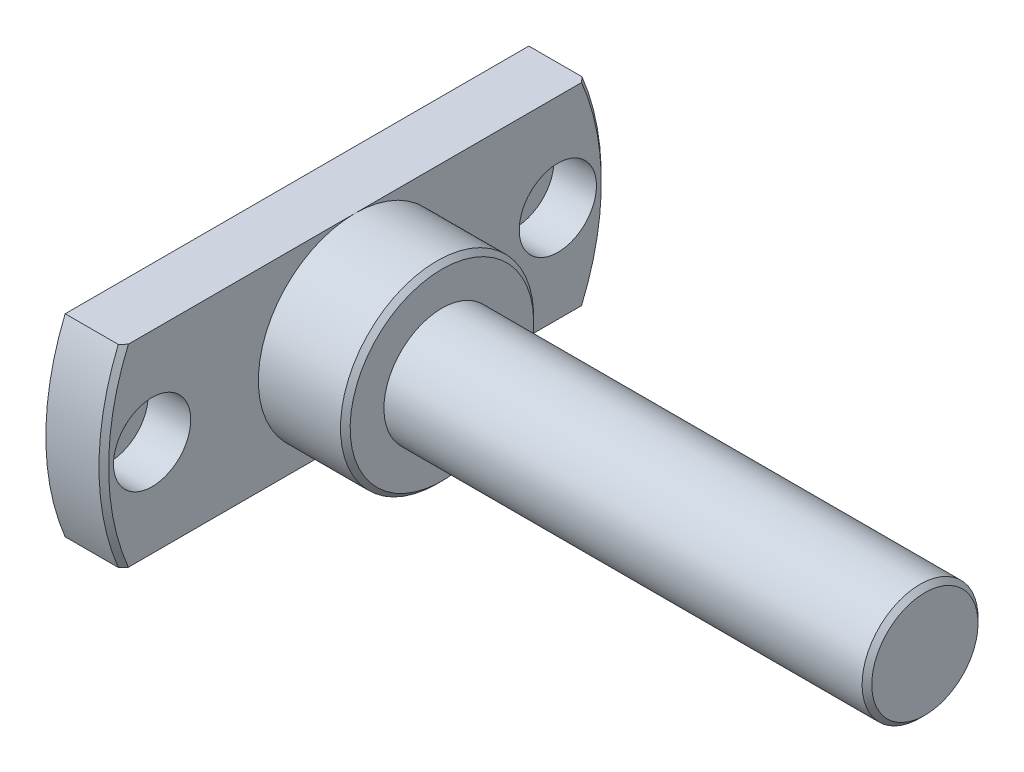
ISO-10303-21;
HEADER;
FILE_DESCRIPTION(('STEP AP214'),'2;1');
FILE_NAME('part.step','',(''),(''),'','','');
FILE_SCHEMA(('AUTOMOTIVE_DESIGN { 1 0 10303 214 1 1 1 1 }'));
ENDSEC;
DATA;
#1=APPLICATION_CONTEXT('core data for automotive mechanical design processes');
#2=APPLICATION_PROTOCOL_DEFINITION('international standard','automotive_design',2000,#1);
#3=PRODUCT_CONTEXT('',#1,'mechanical');
#4=PRODUCT('Part','Part','',(#3));
#5=PRODUCT_RELATED_PRODUCT_CATEGORY('part','',(#4));
#6=PRODUCT_DEFINITION_FORMATION('','',#4);
#7=PRODUCT_DEFINITION_CONTEXT('part definition',#1,'design');
#8=PRODUCT_DEFINITION('design','',#6,#7);
#9=PRODUCT_DEFINITION_SHAPE('','',#8);
#10=(LENGTH_UNIT() NAMED_UNIT(*) SI_UNIT(.MILLI.,.METRE.));
#11=(NAMED_UNIT(*) PLANE_ANGLE_UNIT() SI_UNIT($,.RADIAN.));
#12=(NAMED_UNIT(*) SI_UNIT($,.STERADIAN.) SOLID_ANGLE_UNIT());
#13=UNCERTAINTY_MEASURE_WITH_UNIT(LENGTH_MEASURE(1.E-05),#10,'distance_accuracy_value','');
#14=(GEOMETRIC_REPRESENTATION_CONTEXT(3) GLOBAL_UNCERTAINTY_ASSIGNED_CONTEXT((#13)) GLOBAL_UNIT_ASSIGNED_CONTEXT((#10,
#11,#12)) REPRESENTATION_CONTEXT('',''));
#15=CARTESIAN_POINT('',(0.,0.,0.));
#16=DIRECTION('',(0.,0.,1.));
#17=DIRECTION('',(1.,0.,0.));
#18=AXIS2_PLACEMENT_3D('',#15,#16,#17);
#19=CARTESIAN_POINT('',(6.,26.,0.));
#20=DIRECTION('',(1.,0.,0.));
#21=DIRECTION('',(0.,1.,0.));
#22=AXIS2_PLACEMENT_3D('',#19,#20,#21);
#23=PLANE('',#22);
#24=DIRECTION('',(0.,0.,-1.));
#25=VECTOR('',#24,1.);
#26=CARTESIAN_POINT('',(6.,10.,0.));
#27=LINE('',#26,#25);
#28=CARTESIAN_POINT('',(6.,10.,23.4574082114798));
#29=VERTEX_POINT('',#28);
#30=CARTESIAN_POINT('',(6.,10.,0.));
#31=VERTEX_POINT('',#30);
#32=EDGE_CURVE('E419',#29,#31,#27,.T.);
#33=ORIENTED_EDGE('',*,*,#32,.F.);
#34=CARTESIAN_POINT('',(6.,0.,0.));
#35=DIRECTION('',(1.,0.,0.));
#36=DIRECTION('',(0.,1.,0.));
#37=AXIS2_PLACEMENT_3D('',#34,#35,#36);
#38=CIRCLE('',#37,25.5);
#39=CARTESIAN_POINT('',(6.,-10.,23.4574082114798));
#40=VERTEX_POINT('',#39);
#41=EDGE_CURVE('E58',#29,#40,#38,.T.);
#42=ORIENTED_EDGE('',*,*,#41,.T.);
#43=DIRECTION('',(0.,0.,1.));
#44=VECTOR('',#43,1.);
#45=CARTESIAN_POINT('',(6.,-10.,0.));
#46=LINE('',#45,#44);
#47=CARTESIAN_POINT('',(6.00000000000001,-10.,0.));
#48=VERTEX_POINT('',#47);
#49=EDGE_CURVE('E408',#48,#40,#46,.T.);
#50=ORIENTED_EDGE('',*,*,#49,.F.);
#51=CARTESIAN_POINT('',(6.00000000000001,0.,0.));
#52=DIRECTION('',(1.,0.,0.));
#53=DIRECTION('',(0.,1.,0.));
#54=AXIS2_PLACEMENT_3D('',#51,#52,#53);
#55=CIRCLE('',#54,9.99999999999999);
#56=EDGE_CURVE('E118',#31,#48,#55,.T.);
#57=ORIENTED_EDGE('',*,*,#56,.F.);
#58=EDGE_LOOP('',(#33,#42,#50,#57));
#59=FACE_BOUND('',#58,.T.);
#60=CARTESIAN_POINT('',(6.,0.,21.));
#61=DIRECTION('',(1.,0.,0.));
#62=DIRECTION('',(0.,0.,-1.));
#63=AXIS2_PLACEMENT_3D('',#60,#61,#62);
#64=CIRCLE('',#63,4.);
#65=CARTESIAN_POINT('',(6.,0.,17.));
#66=VERTEX_POINT('',#65);
#67=EDGE_CURVE('E403',#66,#66,#64,.T.);
#68=ORIENTED_EDGE('',*,*,#67,.F.);
#69=EDGE_LOOP('',(#68));
#70=FACE_BOUND('',#69,.T.);
#71=ADVANCED_FACE('F35',(#59,#70),#23,.T.);
#72=CARTESIAN_POINT('',(65.,0.,0.));
#73=DIRECTION('',(1.,0.,0.));
#74=DIRECTION('',(0.,1.,0.));
#75=AXIS2_PLACEMENT_3D('',#72,#73,#74);
#76=CYLINDRICAL_SURFACE('',#75,26.);
#77=DIRECTION('',(-1.,0.,0.));
#78=VECTOR('',#77,1.);
#79=CARTESIAN_POINT('',(65.,10.,-24.));
#80=LINE('',#79,#78);
#81=CARTESIAN_POINT('',(5.50000000000001,10.,-24.));
#82=VERTEX_POINT('',#81);
#83=CARTESIAN_POINT('',(0.,10.,-24.));
#84=VERTEX_POINT('',#83);
#85=EDGE_CURVE('E94',#82,#84,#80,.T.);
#86=ORIENTED_EDGE('',*,*,#85,.F.);
#87=CARTESIAN_POINT('',(5.50000000000002,0.,0.));
#88=DIRECTION('',(1.,0.,0.));
#89=DIRECTION('',(0.,1.,0.));
#90=AXIS2_PLACEMENT_3D('',#87,#88,#89);
#91=CIRCLE('',#90,26.);
#92=CARTESIAN_POINT('',(5.50000000000001,-10.,-24.));
#93=VERTEX_POINT('',#92);
#94=EDGE_CURVE('E130',#82,#93,#91,.F.);
#95=ORIENTED_EDGE('',*,*,#94,.T.);
#96=DIRECTION('',(-1.,0.,0.));
#97=VECTOR('',#96,1.);
#98=CARTESIAN_POINT('',(65.,-10.,-24.));
#99=LINE('',#98,#97);
#100=CARTESIAN_POINT('',(0.,-10.,-24.));
#101=VERTEX_POINT('',#100);
#102=EDGE_CURVE('E117',#93,#101,#99,.T.);
#103=ORIENTED_EDGE('',*,*,#102,.T.);
#104=CARTESIAN_POINT('',(0.,0.,0.));
#105=DIRECTION('',(1.,0.,0.));
#106=DIRECTION('',(0.,1.,0.));
#107=AXIS2_PLACEMENT_3D('',#104,#105,#106);
#108=CIRCLE('',#107,26.);
#109=EDGE_CURVE('E111',#101,#84,#108,.T.);
#110=ORIENTED_EDGE('',*,*,#109,.T.);
#111=EDGE_LOOP('',(#86,#95,#103,#110));
#112=FACE_BOUND('',#111,.T.);
#113=ADVANCED_FACE('F115',(#112),#76,.T.);
#114=CARTESIAN_POINT('',(6.,0.,0.));
#115=DIRECTION('',(-1.,0.,0.));
#116=DIRECTION('',(0.,-1.,0.));
#117=AXIS2_PLACEMENT_3D('',#114,#115,#116);
#118=CONICAL_SURFACE('',#117,25.5,0.785398163397462);
#119=CARTESIAN_POINT('',(-22.2403583783222,10.,52.8017624576168));
#120=CARTESIAN_POINT('',(-21.5612747358873,10.,52.1106050160797));
#121=CARTESIAN_POINT('',(-20.8824233158428,10.,51.4192193838014));
#122=CARTESIAN_POINT('',(-19.525248352431,10.,50.0359261725188));
#123=CARTESIAN_POINT('',(-18.846924810646,10.,49.3440185919621));
#124=CARTESIAN_POINT('',(-16.8111346974459,10.,47.2656724387419));
#125=CARTESIAN_POINT('',(-15.4545641827864,10.,45.8783558396122));
#126=CARTESIAN_POINT('',(-12.7146414691651,10.,43.0700793252078));
#127=CARTESIAN_POINT('',(-11.3313582605314,10.,41.6490520570187));
#128=CARTESIAN_POINT('',(-9.26056882032157,10.,39.5152271167261));
#129=CARTESIAN_POINT('',(-8.57142564600669,10.,38.8040180479717));
#130=CARTESIAN_POINT('',(-7.1944446370752,10.,37.3803787892495));
#131=CARTESIAN_POINT('',(-6.50660676371825,10.,36.6679486367558));
#132=CARTESIAN_POINT('',(-4.66442319301412,10.,34.7558493459511));
#133=CARTESIAN_POINT('',(-3.51145767762059,10.,33.5548495694882));
#134=CARTESIAN_POINT('',(-1.21113151758138,10.,31.1471526212081));
#135=CARTESIAN_POINT('',(-0.0637717101532882,10.,29.9404546482762));
#136=CARTESIAN_POINT('',(1.65391399916357,10.,28.1216723075976));
#137=CARTESIAN_POINT('',(2.22729650078359,10.,27.5124748735986));
#138=CARTESIAN_POINT('',(3.37155146238387,10.,26.2917280770571));
#139=CARTESIAN_POINT('',(3.94242392727216,10.,25.6801787191179));
#140=CARTESIAN_POINT('',(5.0807938221149,10.,24.4545699302876));
#141=CARTESIAN_POINT('',(5.64829293235741,10.,23.8405120611177));
#142=CARTESIAN_POINT('',(6.77949024144209,10.,22.6089132821059));
#143=CARTESIAN_POINT('',(7.34318847721862,10.,21.9913724062168));
#144=CARTESIAN_POINT('',(8.45482303067721,10.,20.7640686698923));
#145=CARTESIAN_POINT('',(9.00285201713899,10.,20.1543898527024));
#146=CARTESIAN_POINT('',(10.093041084654,10.,18.9297578613442));
#147=CARTESIAN_POINT('',(10.6352009308297,10.,18.3148044778448));
#148=CARTESIAN_POINT('',(11.7130178617387,10.,17.0768233048052));
#149=CARTESIAN_POINT('',(12.2486580335642,10.,16.4537807383512));
#150=CARTESIAN_POINT('',(13.0442661083262,10.,15.5126399503163));
#151=CARTESIAN_POINT('',(13.3081457132626,10.,15.1978478048739));
#152=CARTESIAN_POINT('',(13.8328305138945,10.,14.565713573772));
#153=CARTESIAN_POINT('',(14.0936357394756,10.,14.2483715129503));
#154=CARTESIAN_POINT('',(14.6091690836004,10.,13.6137461412684));
#155=CARTESIAN_POINT('',(14.8639313355643,10.,13.2964905904598));
#156=CARTESIAN_POINT('',(15.3692096484206,10.,12.6586062072016));
#157=CARTESIAN_POINT('',(15.6197256724818,10.,12.3379773455315));
#158=CARTESIAN_POINT('',(16.1157896699968,10.,11.6925865464576));
#159=CARTESIAN_POINT('',(16.3613345827448,10.,11.3678222519717));
#160=CARTESIAN_POINT('',(16.8461812999863,10.,10.7136656933156));
#161=CARTESIAN_POINT('',(17.085483242339,10.,10.384273531587));
#162=CARTESIAN_POINT('',(17.5555071445035,10.,9.72128358219486));
#163=CARTESIAN_POINT('',(17.7862582138339,10.,9.38770649375731));
#164=CARTESIAN_POINT('',(18.238278605045,10.,8.71410595268329));
#165=CARTESIAN_POINT('',(18.459546895644,10.,8.37408180467986));
#166=CARTESIAN_POINT('',(18.8898308219094,10.,7.68687780250099));
#167=CARTESIAN_POINT('',(19.0988601157554,10.,7.33970653268233));
#168=CARTESIAN_POINT('',(19.5015934388649,10.,6.63662584521409));
#169=CARTESIAN_POINT('',(19.6953025283389,10.,6.28071936409857));
#170=CARTESIAN_POINT('',(19.9188660000856,10.,5.84184430737448));
#171=CARTESIAN_POINT('',(19.9581278701709,10.,5.76363238720583));
#172=CARTESIAN_POINT('',(20.0356807050489,10.,5.60671694250312));
#173=CARTESIAN_POINT('',(20.0739715573071,10.,5.52801336229436));
#174=CARTESIAN_POINT('',(20.1873178943465,10.,5.29112563682431));
#175=CARTESIAN_POINT('',(20.2608298221693,10.,5.13219843837458));
#176=CARTESIAN_POINT('',(20.4032579349509,10.,4.81229630603637));
#177=CARTESIAN_POINT('',(20.472174160992,10.,4.6513213904683));
#178=CARTESIAN_POINT('',(20.6048874366695,10.,4.32727695302568));
#179=CARTESIAN_POINT('',(20.6686846815542,10.,4.16420751131604));
#180=CARTESIAN_POINT('',(20.789876832807,10.,3.83789068332271));
#181=CARTESIAN_POINT('',(20.8473385841185,10.,3.67466825126644));
#182=CARTESIAN_POINT('',(20.9561368395426,10.,3.34620449479463));
#183=CARTESIAN_POINT('',(21.0074733289336,10.,3.18096316552785));
#184=CARTESIAN_POINT('',(21.1514076099207,10.,2.68226268311777));
#185=CARTESIAN_POINT('',(21.2339441194051,10.,2.3457902962389));
#186=CARTESIAN_POINT('',(21.357438212461,10.,1.71797671550052));
#187=CARTESIAN_POINT('',(21.4027945177991,10.,1.42750015545532));
#188=CARTESIAN_POINT('',(21.4686504516251,10.,0.843783113145917));
#189=CARTESIAN_POINT('',(21.489158356838,10.,0.550543584012278));
#190=CARTESIAN_POINT('',(21.5042295005792,10.,-0.0362191506601161));
#191=CARTESIAN_POINT('',(21.4988273529531,10.,-0.329741454284256));
#192=CARTESIAN_POINT('',(21.4624615172561,10.,-0.915225927086295));
#193=CARTESIAN_POINT('',(21.4314920930071,10.,-1.20718773136044));
#194=CARTESIAN_POINT('',(21.3341406265866,10.,-1.86451602224747));
#195=CARTESIAN_POINT('',(21.2605454204209,10.,-2.22881609874173));
#196=CARTESIAN_POINT('',(21.0800736488043,10.,-2.94902328659909));
#197=CARTESIAN_POINT('',(20.9731835551769,10.,-3.30492692302535));
#198=CARTESIAN_POINT('',(20.7312362984397,10.,-4.00956142465338));
#199=CARTESIAN_POINT('',(20.5959966208767,10.,-4.35822888296434));
#200=CARTESIAN_POINT('',(20.3765301149904,10.,-4.87398827446875));
#201=CARTESIAN_POINT('',(20.3006095089702,10.,-5.04469569459139));
#202=CARTESIAN_POINT('',(20.143814556541,10.,-5.38382317138972));
#203=CARTESIAN_POINT('',(20.0629402447436,10.,-5.55224324403713));
#204=CARTESIAN_POINT('',(19.8445029928583,10.,-5.99221737716304));
#205=CARTESIAN_POINT('',(19.7032986142867,10.,-6.26196414532372));
#206=CARTESIAN_POINT('',(19.4112317353663,10.,-6.79620036644));
#207=CARTESIAN_POINT('',(19.2603676084421,10.,-7.06068892410351));
#208=CARTESIAN_POINT('',(18.9505398110338,10.,-7.58509924112959));
#209=CARTESIAN_POINT('',(18.7915708486963,10.,-7.84501786380673));
#210=CARTESIAN_POINT('',(18.4669668206995,10.,-8.36062568773649));
#211=CARTESIAN_POINT('',(18.301332102517,10.,-8.61631510847383));
#212=CARTESIAN_POINT('',(17.964033962277,10.,-9.12461643177559));
#213=CARTESIAN_POINT('',(17.7923562539125,10.,-9.37721883237055));
#214=CARTESIAN_POINT('',(17.4442370049572,10.,-9.87912437889284));
#215=CARTESIAN_POINT('',(17.2677952913184,10.,-10.1284274044819));
#216=CARTESIAN_POINT('',(16.7325555118659,10.,-10.8718006667833));
#217=CARTESIAN_POINT('',(16.3677163780505,10.,-11.3615232935205));
#218=CARTESIAN_POINT('',(15.6227349537004,10.,-12.336411471817));
#219=CARTESIAN_POINT('',(15.2424813030913,10.,-12.8214913254404));
#220=CARTESIAN_POINT('',(14.4728152119387,10.,-13.784363032113));
#221=CARTESIAN_POINT('',(14.0834021851082,10.,-14.2621544153863));
#222=CARTESIAN_POINT('',(13.2981754112239,10.,-15.2110879407202));
#223=CARTESIAN_POINT('',(12.9023734505258,10.,-15.6822398617957));
#224=CARTESIAN_POINT('',(12.1052316114785,10.,-16.6198045494242));
#225=CARTESIAN_POINT('',(11.7038918925731,10.,-17.0862174517549));
#226=CARTESIAN_POINT('',(10.9575644174625,10.,-17.9451873852627));
#227=CARTESIAN_POINT('',(10.6131969338092,10.,-18.3382842077784));
#228=CARTESIAN_POINT('',(9.92175892453575,10.,-19.1220945136459));
#229=CARTESIAN_POINT('',(9.57468838785723,10.,-19.5128079872356));
#230=CARTESIAN_POINT('',(8.53004873019611,10.,-20.6819143364777));
#231=CARTESIAN_POINT('',(7.82906573232548,10.,-21.4572569037019));
#232=CARTESIAN_POINT('',(6.4203651136193,10.,-23.0019152970569));
#233=CARTESIAN_POINT('',(5.71264687750442,10.,-23.7712305606452));
#234=CARTESIAN_POINT('',(4.29213794511411,10.,-25.3051673481364));
#235=CARTESIAN_POINT('',(3.57934722238805,10.,-26.0697888475247));
#236=CARTESIAN_POINT('',(2.14908819434675,10.,-27.596141776241));
#237=CARTESIAN_POINT('',(1.43161578058529,10.,-28.3578693522087));
#238=CARTESIAN_POINT('',(-0.0064495612580233,10.,-29.8783749902765));
#239=CARTESIAN_POINT('',(-0.727042496884534,10.,-30.6371530452369));
#240=CARTESIAN_POINT('',(-2.17069708215139,10.,-32.1522734665969));
#241=CARTESIAN_POINT('',(-2.89375858882345,10.,-32.9086159692828));
#242=CARTESIAN_POINT('',(-4.34193499991896,10.,-34.4193325654213));
#243=CARTESIAN_POINT('',(-5.06704990542356,10.,-35.173706657837));
#244=CARTESIAN_POINT('',(-7.15638279504205,10.,-37.3424770455778));
#245=CARTESIAN_POINT('',(-8.52273448531804,10.,-38.7548176713341));
#246=CARTESIAN_POINT('',(-11.2597417073921,10.,-41.5753657256972));
#247=CARTESIAN_POINT('',(-12.6303973128756,10.,-42.9835730827327));
#248=CARTESIAN_POINT('',(-15.3729067421093,10.,-45.7948102614074));
#249=CARTESIAN_POINT('',(-16.7447558955025,10.,-47.1978446403636));
#250=CARTESIAN_POINT('',(-18.8043502285911,10.,-49.3005829392414));
#251=CARTESIAN_POINT('',(-19.4911778330673,10.,-50.0011860937428));
#252=CARTESIAN_POINT('',(-20.8653769839196,10.,-51.4018583558061));
#253=CARTESIAN_POINT('',(-21.5527485301364,10.,-52.1019274635244));
#254=CARTESIAN_POINT('',(-22.2403583783222,10.,-52.8017624576168));
#255=B_SPLINE_CURVE_WITH_KNOTS('',3,(#119,#120,#121,#122,#123,#124,#125,#126,#127,#128,#129,
#130,#131,#132,#133,#134,#135,#136,#137,#138,#139,#140,#141,#142,#143,#144,#145,#146,#147,#148,
#149,#150,#151,#152,#153,#154,#155,#156,#157,#158,#159,#160,#161,#162,#163,#164,#165,#166,#167,
#168,#169,#170,#171,#172,#173,#174,#175,#176,#177,#178,#179,#180,#181,#182,#183,#184,#185,#186,
#187,#188,#189,#190,#191,#192,#193,#194,#195,#196,#197,#198,#199,#200,#201,#202,#203,#204,#205,
#206,#207,#208,#209,#210,#211,#212,#213,#214,#215,#216,#217,#218,#219,#220,#221,#222,#223,#224,
#225,#226,#227,#228,#229,#230,#231,#232,#233,#234,#235,#236,#237,#238,#239,#240,#241,#242,#243,
#244,#245,#246,#247,#248,#249,#250,#251,#252,#253,#254),.UNSPECIFIED.,.F.,.F.,(4,2,2,2,2,2,2,2,
2,2,2,2,2,2,2,2,2,2,2,2,2,2,2,2,2,2,2,2,2,2,2,2,2,2,2,2,2,2,2,2,2,2,2,2,2,2,2,2,2,2,2,2,2,2,2,2,
2,2,2,2,2,2,2,2,2,2,2,4),(0.,2.9068330686457,5.81367481721768,11.6347003187043,17.5840721197438,
20.5550352443236,23.5259087689908,28.5204500316263,33.5157157299945,36.025491337479,
38.535262035255,41.0436553662292,43.5520242870759,46.0113426777319,48.4707591268674,
50.9355815264772,52.1678563114068,53.4001191077008,54.6207420429253,55.8413755602407,
57.0627390687667,58.2840755838829,59.5007780446634,60.7176124915841,61.9330620555438,
63.1481084693931,63.4106440757015,63.6732099703682,64.1984560387968,64.7236974112798,
65.2489187404713,65.7679230907327,66.2869286883604,67.3248223460703,68.2058556764477,
69.0865954637031,69.9661589780581,70.8459198816282,71.9589864050182,73.0725057740778,
74.1934271487563,74.7538515389882,75.3142720139664,76.2274271190435,77.1407363939451,
78.0546498253195,78.9685156771714,79.8847101509474,80.8009379495425,82.6327137298218,
84.4816535176423,86.3307119789595,88.1766798432578,90.0225946686645,91.5903903759547,
93.1581925005472,96.293861398278,99.4298195499642,102.565794066189,105.705044453803,
108.844302435584,111.98338158994,115.122462397367,121.017751768516,126.913142626646,
132.799927042925,135.74325699266,138.686586079856),.UNSPECIFIED.);
#256=CARTESIAN_POINT('',(5.50000000000001,10.,24.));
#257=VERTEX_POINT('',#256);
#258=EDGE_CURVE('E228',#257,#29,#255,.T.);
#259=ORIENTED_EDGE('',*,*,#258,.F.);
#260=CARTESIAN_POINT('',(5.50000000000001,-10.,24.));
#261=VERTEX_POINT('',#260);
#262=EDGE_CURVE('E131',#261,#257,#91,.F.);
#263=ORIENTED_EDGE('',*,*,#262,.F.);
#264=CARTESIAN_POINT('',(-22.2403583783222,-10.,-52.8017624576168));
#265=CARTESIAN_POINT('',(-21.5612747358873,-10.,-52.1106050160798));
#266=CARTESIAN_POINT('',(-20.8824233158428,-10.,-51.4192193838015));
#267=CARTESIAN_POINT('',(-19.525248352431,-10.,-50.0359261725188));
#268=CARTESIAN_POINT('',(-18.846924810646,-10.,-49.3440185919621));
#269=CARTESIAN_POINT('',(-16.8111346974459,-10.,-47.265672438742));
#270=CARTESIAN_POINT('',(-15.4545641827864,-10.,-45.8783558396123));
#271=CARTESIAN_POINT('',(-12.7146414691651,-10.,-43.0700793252078));
#272=CARTESIAN_POINT('',(-11.3313582605315,-10.,-41.6490520570188));
#273=CARTESIAN_POINT('',(-9.26056882032161,-10.,-39.5152271167262));
#274=CARTESIAN_POINT('',(-8.57142564600674,-10.,-38.8040180479717));
#275=CARTESIAN_POINT('',(-7.19444463707525,-10.,-37.3803787892495));
#276=CARTESIAN_POINT('',(-6.5066067637183,-10.,-36.6679486367559));
#277=CARTESIAN_POINT('',(-4.66442319301416,-10.,-34.7558493459512));
#278=CARTESIAN_POINT('',(-3.51145767762063,-10.,-33.5548495694883));
#279=CARTESIAN_POINT('',(-1.21113151758143,-10.,-31.1471526212081));
#280=CARTESIAN_POINT('',(-0.0637717101533326,-10.,-29.9404546482762));
#281=CARTESIAN_POINT('',(1.65391399916353,-10.,-28.1216723075977));
#282=CARTESIAN_POINT('',(2.22729650078356,-10.,-27.5124748735987));
#283=CARTESIAN_POINT('',(3.37155146238384,-10.,-26.2917280770572));
#284=CARTESIAN_POINT('',(3.94242392727213,-10.,-25.6801787191179));
#285=CARTESIAN_POINT('',(5.08079382211487,-10.,-24.4545699302876));
#286=CARTESIAN_POINT('',(5.64829293235739,-10.,-23.8405120611178));
#287=CARTESIAN_POINT('',(6.77949024144207,-10.,-22.6089132821059));
#288=CARTESIAN_POINT('',(7.3431884772186,-10.,-21.9913724062168));
#289=CARTESIAN_POINT('',(8.45482303067719,-10.,-20.7640686698923));
#290=CARTESIAN_POINT('',(9.00285201713897,-10.,-20.1543898527024));
#291=CARTESIAN_POINT('',(10.093041084654,-10.,-18.9297578613442));
#292=CARTESIAN_POINT('',(10.6352009308297,-10.,-18.3148044778449));
#293=CARTESIAN_POINT('',(11.7130178617387,-10.,-17.0768233048052));
#294=CARTESIAN_POINT('',(12.2486580335642,-10.,-16.4537807383512));
#295=CARTESIAN_POINT('',(13.0442661083262,-10.,-15.5126399503164));
#296=CARTESIAN_POINT('',(13.3081457132626,-10.,-15.1978478048739));
#297=CARTESIAN_POINT('',(13.8328305138945,-10.,-14.565713573772));
#298=CARTESIAN_POINT('',(14.0936357394756,-10.,-14.2483715129504));
#299=CARTESIAN_POINT('',(14.6091690836004,-10.,-13.6137461412684));
#300=CARTESIAN_POINT('',(14.8639313355643,-10.,-13.2964905904598));
#301=CARTESIAN_POINT('',(15.3692096484206,-10.,-12.6586062072017));
#302=CARTESIAN_POINT('',(15.6197256724818,-10.,-12.3379773455315));
#303=CARTESIAN_POINT('',(16.1157896699968,-10.,-11.6925865464576));
#304=CARTESIAN_POINT('',(16.3613345827448,-10.,-11.3678222519717));
#305=CARTESIAN_POINT('',(16.8461812999863,-10.,-10.7136656933156));
#306=CARTESIAN_POINT('',(17.085483242339,-10.,-10.384273531587));
#307=CARTESIAN_POINT('',(17.5555071445035,-10.,-9.72128358219486));
#308=CARTESIAN_POINT('',(17.7862582138339,-10.,-9.38770649375732));
#309=CARTESIAN_POINT('',(18.238278605045,-10.,-8.71410595268329));
#310=CARTESIAN_POINT('',(18.459546895644,-10.,-8.37408180467987));
#311=CARTESIAN_POINT('',(18.8898308219094,-10.,-7.686877802501));
#312=CARTESIAN_POINT('',(19.0988601157554,-10.,-7.33970653268233));
#313=CARTESIAN_POINT('',(19.5015934388649,-10.,-6.63662584521409));
#314=CARTESIAN_POINT('',(19.6953025283389,-10.,-6.28071936409857));
#315=CARTESIAN_POINT('',(19.9188660000856,-10.,-5.84184430737449));
#316=CARTESIAN_POINT('',(19.9581278701709,-10.,-5.76363238720584));
#317=CARTESIAN_POINT('',(20.0356807050489,-10.,-5.60671694250313));
#318=CARTESIAN_POINT('',(20.0739715573071,-10.,-5.52801336229438));
#319=CARTESIAN_POINT('',(20.1873178943465,-10.,-5.29112563682432));
#320=CARTESIAN_POINT('',(20.2608298221693,-10.,-5.13219843837459));
#321=CARTESIAN_POINT('',(20.4032579349509,-10.,-4.81229630603637));
#322=CARTESIAN_POINT('',(20.472174160992,-10.,-4.6513213904683));
#323=CARTESIAN_POINT('',(20.6048874366695,-10.,-4.32727695302568));
#324=CARTESIAN_POINT('',(20.6686846815542,-10.,-4.16420751131604));
#325=CARTESIAN_POINT('',(20.789876832807,-10.,-3.83789068332271));
#326=CARTESIAN_POINT('',(20.8473385841185,-10.,-3.67466825126644));
#327=CARTESIAN_POINT('',(20.9561368395426,-10.,-3.34620449479463));
#328=CARTESIAN_POINT('',(21.0074733289336,-10.,-3.18096316552785));
#329=CARTESIAN_POINT('',(21.1514076099207,-10.,-2.68226268311776));
#330=CARTESIAN_POINT('',(21.2339441194051,-10.,-2.3457902962389));
#331=CARTESIAN_POINT('',(21.357438212461,-10.,-1.71797671550052));
#332=CARTESIAN_POINT('',(21.4027945177991,-10.,-1.42750015545532));
#333=CARTESIAN_POINT('',(21.4686504516251,-10.,-0.843783113145917));
#334=CARTESIAN_POINT('',(21.489158356838,-10.,-0.550543584012279));
#335=CARTESIAN_POINT('',(21.5042295005792,-10.,0.0362191506601153));
#336=CARTESIAN_POINT('',(21.4988273529531,-10.,0.329741454284255));
#337=CARTESIAN_POINT('',(21.4624615172561,-10.,0.915225927086295));
#338=CARTESIAN_POINT('',(21.4314920930071,-10.,1.20718773136044));
#339=CARTESIAN_POINT('',(21.3341406265866,-10.,1.86451602224747));
#340=CARTESIAN_POINT('',(21.2605454204209,-10.,2.22881609874173));
#341=CARTESIAN_POINT('',(21.0800736488043,-10.,2.94902328659909));
#342=CARTESIAN_POINT('',(20.9731835551769,-10.,3.30492692302535));
#343=CARTESIAN_POINT('',(20.7312362984397,-10.,4.00956142465339));
#344=CARTESIAN_POINT('',(20.5959966208767,-10.,4.35822888296435));
#345=CARTESIAN_POINT('',(20.3765301149904,-10.,4.87398827446876));
#346=CARTESIAN_POINT('',(20.3006095089702,-10.,5.0446956945914));
#347=CARTESIAN_POINT('',(20.143814556541,-10.,5.38382317138973));
#348=CARTESIAN_POINT('',(20.0629402447436,-10.,5.55224324403714));
#349=CARTESIAN_POINT('',(19.8445029928583,-10.,5.99221737716304));
#350=CARTESIAN_POINT('',(19.7032986142867,-10.,6.26196414532372));
#351=CARTESIAN_POINT('',(19.4112317353663,-10.,6.79620036644));
#352=CARTESIAN_POINT('',(19.2603676084421,-10.,7.06068892410352));
#353=CARTESIAN_POINT('',(18.9505398110338,-10.,7.58509924112959));
#354=CARTESIAN_POINT('',(18.7915708486963,-10.,7.84501786380673));
#355=CARTESIAN_POINT('',(18.4669668206995,-10.,8.36062568773649));
#356=CARTESIAN_POINT('',(18.301332102517,-10.,8.61631510847383));
#357=CARTESIAN_POINT('',(17.964033962277,-10.,9.12461643177559));
#358=CARTESIAN_POINT('',(17.7923562539124,-10.,9.37721883237055));
#359=CARTESIAN_POINT('',(17.4442370049572,-10.,9.87912437889285));
#360=CARTESIAN_POINT('',(17.2677952913184,-10.,10.1284274044819));
#361=CARTESIAN_POINT('',(16.7325555118659,-10.,10.8718006667834));
#362=CARTESIAN_POINT('',(16.3677163780505,-10.,11.3615232935205));
#363=CARTESIAN_POINT('',(15.6227349537004,-10.,12.336411471817));
#364=CARTESIAN_POINT('',(15.2424813030913,-10.,12.8214913254405));
#365=CARTESIAN_POINT('',(14.4728152119387,-10.,13.784363032113));
#366=CARTESIAN_POINT('',(14.0834021851082,-10.,14.2621544153863));
#367=CARTESIAN_POINT('',(13.2981754112239,-10.,15.2110879407202));
#368=CARTESIAN_POINT('',(12.9023734505258,-10.,15.6822398617957));
#369=CARTESIAN_POINT('',(12.1052316114785,-10.,16.6198045494242));
#370=CARTESIAN_POINT('',(11.7038918925731,-10.,17.0862174517549));
#371=CARTESIAN_POINT('',(10.9575644174625,-10.,17.9451873852627));
#372=CARTESIAN_POINT('',(10.6131969338092,-10.,18.3382842077784));
#373=CARTESIAN_POINT('',(9.92175892453574,-10.,19.1220945136459));
#374=CARTESIAN_POINT('',(9.57468838785722,-10.,19.5128079872356));
#375=CARTESIAN_POINT('',(8.53004873019611,-10.,20.6819143364777));
#376=CARTESIAN_POINT('',(7.82906573232547,-10.,21.4572569037019));
#377=CARTESIAN_POINT('',(6.42036511361929,-10.,23.001915297057));
#378=CARTESIAN_POINT('',(5.71264687750442,-10.,23.7712305606452));
#379=CARTESIAN_POINT('',(4.2921379451141,-10.,25.3051673481364));
#380=CARTESIAN_POINT('',(3.57934722238803,-10.,26.0697888475247));
#381=CARTESIAN_POINT('',(2.14908819434673,-10.,27.596141776241));
#382=CARTESIAN_POINT('',(1.43161578058528,-10.,28.3578693522087));
#383=CARTESIAN_POINT('',(-0.00644956125803544,-10.,29.8783749902765));
#384=CARTESIAN_POINT('',(-0.727042496884549,-10.,30.6371530452369));
#385=CARTESIAN_POINT('',(-2.17069708215141,-10.,32.1522734665969));
#386=CARTESIAN_POINT('',(-2.89375858882347,-10.,32.9086159692828));
#387=CARTESIAN_POINT('',(-4.34193499991898,-10.,34.4193325654213));
#388=CARTESIAN_POINT('',(-5.06704990542358,-10.,35.173706657837));
#389=CARTESIAN_POINT('',(-7.15638279504206,-10.,37.3424770455778));
#390=CARTESIAN_POINT('',(-8.52273448531805,-10.,38.7548176713341));
#391=CARTESIAN_POINT('',(-11.2597417073921,-10.,41.5753657256972));
#392=CARTESIAN_POINT('',(-12.6303973128756,-10.,42.9835730827327));
#393=CARTESIAN_POINT('',(-15.3729067421093,-10.,45.7948102614074));
#394=CARTESIAN_POINT('',(-16.7447558955025,-10.,47.1978446403636));
#395=CARTESIAN_POINT('',(-18.8043502285911,-10.,49.3005829392414));
#396=CARTESIAN_POINT('',(-19.4911778330673,-10.,50.0011860937428));
#397=CARTESIAN_POINT('',(-20.8653769839196,-10.,51.4018583558061));
#398=CARTESIAN_POINT('',(-21.5527485301364,-10.,52.1019274635244));
#399=CARTESIAN_POINT('',(-22.2403583783222,-10.,52.8017624576168));
#400=B_SPLINE_CURVE_WITH_KNOTS('',3,(#264,#265,#266,#267,#268,#269,#270,#271,#272,#273,#274,
#275,#276,#277,#278,#279,#280,#281,#282,#283,#284,#285,#286,#287,#288,#289,#290,#291,#292,#293,
#294,#295,#296,#297,#298,#299,#300,#301,#302,#303,#304,#305,#306,#307,#308,#309,#310,#311,#312,
#313,#314,#315,#316,#317,#318,#319,#320,#321,#322,#323,#324,#325,#326,#327,#328,#329,#330,#331,
#332,#333,#334,#335,#336,#337,#338,#339,#340,#341,#342,#343,#344,#345,#346,#347,#348,#349,#350,
#351,#352,#353,#354,#355,#356,#357,#358,#359,#360,#361,#362,#363,#364,#365,#366,#367,#368,#369,
#370,#371,#372,#373,#374,#375,#376,#377,#378,#379,#380,#381,#382,#383,#384,#385,#386,#387,#388,
#389,#390,#391,#392,#393,#394,#395,#396,#397,#398,#399),.UNSPECIFIED.,.F.,.F.,(4,2,2,2,2,2,2,2,
2,2,2,2,2,2,2,2,2,2,2,2,2,2,2,2,2,2,2,2,2,2,2,2,2,2,2,2,2,2,2,2,2,2,2,2,2,2,2,2,2,2,2,2,2,2,2,2,
2,2,2,2,2,2,2,2,2,2,2,4),(0.,2.90683306864569,5.81367481721766,11.6347003187043,
17.5840721197438,20.5550352443235,23.5259087689907,28.5204500316262,33.5157157299944,
36.025491337479,38.5352620352549,41.0436553662291,43.5520242870759,46.0113426777318,
48.4707591268674,50.9355815264772,52.1678563114068,53.4001191077007,54.6207420429253,
55.8413755602407,57.0627390687667,58.2840755838828,59.5007780446634,60.7176124915841,
61.9330620555438,63.1481084693931,63.4106440757014,63.6732099703681,64.1984560387968,
64.7236974112798,65.2489187404713,65.7679230907327,66.2869286883604,67.3248223460702,
68.2058556764477,69.0865954637031,69.9661589780581,70.8459198816282,71.9589864050182,
73.0725057740778,74.1934271487563,74.7538515389882,75.3142720139664,76.2274271190435,
77.1407363939451,78.0546498253195,78.9685156771714,79.8847101509474,80.8009379495425,
82.6327137298218,84.4816535176423,86.3307119789595,88.1766798432577,90.0225946686645,
91.5903903759547,93.1581925005472,96.293861398278,99.4298195499642,102.56579406619,
105.705044453803,108.844302435584,111.98338158994,115.122462397367,121.017751768516,
126.913142626646,132.799927042925,135.74325699266,138.686586079856),.UNSPECIFIED.);
#401=EDGE_CURVE('E216',#40,#261,#400,.T.);
#402=ORIENTED_EDGE('',*,*,#401,.F.);
#403=ORIENTED_EDGE('',*,*,#41,.F.);
#404=EDGE_LOOP('',(#259,#263,#402,#403));
#405=FACE_BOUND('',#404,.T.);
#406=ADVANCED_FACE('F158',(#405),#118,.T.);
#407=CARTESIAN_POINT('',(15.,9.99999999999999,0.));
#408=DIRECTION('',(1.,0.,0.));
#409=DIRECTION('',(0.,1.,0.));
#410=AXIS2_PLACEMENT_3D('',#407,#408,#409);
#411=PLANE('',#410);
#412=CARTESIAN_POINT('',(15.,0.,0.));
#413=DIRECTION('',(1.,0.,0.));
#414=DIRECTION('',(0.,1.,0.));
#415=AXIS2_PLACEMENT_3D('',#412,#413,#414);
#416=CIRCLE('',#415,9.50000000000001);
#417=CARTESIAN_POINT('',(15.,9.50000000000001,0.));
#418=VERTEX_POINT('',#417);
#419=EDGE_CURVE('E134',#418,#418,#416,.T.);
#420=ORIENTED_EDGE('',*,*,#419,.T.);
#421=EDGE_LOOP('',(#420));
#422=FACE_BOUND('',#421,.T.);
#423=CARTESIAN_POINT('',(15.,0.,0.));
#424=DIRECTION('',(1.,0.,0.));
#425=DIRECTION('',(0.,1.,0.));
#426=AXIS2_PLACEMENT_3D('',#423,#424,#425);
#427=CIRCLE('',#426,6.);
#428=CARTESIAN_POINT('',(15.,6.,0.));
#429=VERTEX_POINT('',#428);
#430=EDGE_CURVE('E122',#429,#429,#427,.T.);
#431=ORIENTED_EDGE('',*,*,#430,.F.);
#432=EDGE_LOOP('',(#431));
#433=FACE_BOUND('',#432,.T.);
#434=ADVANCED_FACE('F171',(#422,#433),#411,.T.);
#435=CARTESIAN_POINT('',(65.,0.,0.));
#436=DIRECTION('',(1.,0.,0.));
#437=DIRECTION('',(0.,1.,0.));
#438=AXIS2_PLACEMENT_3D('',#435,#436,#437);
#439=CYLINDRICAL_SURFACE('',#438,9.99999999999999);
#440=EDGE_CURVE('E120',#48,#31,#55,.T.);
#441=ORIENTED_EDGE('',*,*,#440,.T.);
#442=ORIENTED_EDGE('',*,*,#56,.T.);
#443=EDGE_LOOP('',(#441,#442));
#444=FACE_BOUND('',#443,.T.);
#445=CARTESIAN_POINT('',(14.5,0.,0.));
#446=DIRECTION('',(1.,0.,0.));
#447=DIRECTION('',(0.,1.,0.));
#448=AXIS2_PLACEMENT_3D('',#445,#446,#447);
#449=CIRCLE('',#448,9.99999999999999);
#450=CARTESIAN_POINT('',(14.5,10.,0.));
#451=VERTEX_POINT('',#450);
#452=EDGE_CURVE('E137',#451,#451,#449,.F.);
#453=ORIENTED_EDGE('',*,*,#452,.T.);
#454=EDGE_LOOP('',(#453));
#455=FACE_BOUND('',#454,.T.);
#456=ADVANCED_FACE('F164',(#444,#455),#439,.T.);
#457=CARTESIAN_POINT('',(6.,10.,-23.4574082114798));
#458=VERTEX_POINT('',#457);
#459=EDGE_CURVE('E50',#31,#458,#27,.T.);
#460=ORIENTED_EDGE('',*,*,#459,.F.);
#461=ORIENTED_EDGE('',*,*,#440,.F.);
#462=CARTESIAN_POINT('',(6.,-10.,-23.4574082114798));
#463=VERTEX_POINT('',#462);
#464=EDGE_CURVE('E409',#463,#48,#46,.T.);
#465=ORIENTED_EDGE('',*,*,#464,.F.);
#466=EDGE_CURVE('E127',#463,#458,#38,.T.);
#467=ORIENTED_EDGE('',*,*,#466,.T.);
#468=EDGE_LOOP('',(#460,#461,#465,#467));
#469=FACE_BOUND('',#468,.T.);
#470=CARTESIAN_POINT('',(6.,0.,-21.));
#471=DIRECTION('',(1.,0.,0.));
#472=DIRECTION('',(0.,0.,-1.));
#473=AXIS2_PLACEMENT_3D('',#470,#471,#472);
#474=CIRCLE('',#473,4.);
#475=CARTESIAN_POINT('',(6.,0.,-25.));
#476=VERTEX_POINT('',#475);
#477=EDGE_CURVE('E178',#476,#476,#474,.T.);
#478=ORIENTED_EDGE('',*,*,#477,.F.);
#479=EDGE_LOOP('',(#478));
#480=FACE_BOUND('',#479,.T.);
#481=ADVANCED_FACE('F154',(#469,#480),#23,.T.);
#482=DIRECTION('',(-1.,0.,0.));
#483=VECTOR('',#482,1.);
#484=CARTESIAN_POINT('',(65.,10.,24.));
#485=LINE('',#484,#483);
#486=CARTESIAN_POINT('',(0.,10.,24.));
#487=VERTEX_POINT('',#486);
#488=EDGE_CURVE('E103',#257,#487,#485,.T.);
#489=ORIENTED_EDGE('',*,*,#488,.T.);
#490=CARTESIAN_POINT('',(0.,-10.,24.));
#491=VERTEX_POINT('',#490);
#492=EDGE_CURVE('E112',#487,#491,#108,.T.);
#493=ORIENTED_EDGE('',*,*,#492,.T.);
#494=DIRECTION('',(-1.,0.,0.));
#495=VECTOR('',#494,1.);
#496=CARTESIAN_POINT('',(65.,-10.,24.));
#497=LINE('',#496,#495);
#498=EDGE_CURVE('E414',#261,#491,#497,.T.);
#499=ORIENTED_EDGE('',*,*,#498,.F.);
#500=ORIENTED_EDGE('',*,*,#262,.T.);
#501=EDGE_LOOP('',(#489,#493,#499,#500));
#502=FACE_BOUND('',#501,.T.);
#503=ADVANCED_FACE('F160',(#502),#76,.T.);
#504=CARTESIAN_POINT('',(0.,0.,0.));
#505=DIRECTION('',(-1.,0.,0.));
#506=DIRECTION('',(0.,-1.,0.));
#507=AXIS2_PLACEMENT_3D('',#504,#505,#506);
#508=PLANE('',#507);
#509=DIRECTION('',(0.,0.,1.));
#510=VECTOR('',#509,1.);
#511=CARTESIAN_POINT('',(0.,10.,24.));
#512=LINE('',#511,#510);
#513=EDGE_CURVE('E97',#84,#487,#512,.T.);
#514=ORIENTED_EDGE('',*,*,#513,.F.);
#515=ORIENTED_EDGE('',*,*,#109,.F.);
#516=DIRECTION('',(0.,0.,-1.));
#517=VECTOR('',#516,1.);
#518=CARTESIAN_POINT('',(0.,-10.,24.));
#519=LINE('',#518,#517);
#520=EDGE_CURVE('E422',#491,#101,#519,.T.);
#521=ORIENTED_EDGE('',*,*,#520,.F.);
#522=ORIENTED_EDGE('',*,*,#492,.F.);
#523=EDGE_LOOP('',(#514,#515,#521,#522));
#524=FACE_BOUND('',#523,.T.);
#525=CARTESIAN_POINT('',(0.,0.,21.));
#526=DIRECTION('',(1.,0.,0.));
#527=DIRECTION('',(0.,0.,-1.));
#528=AXIS2_PLACEMENT_3D('',#525,#526,#527);
#529=CIRCLE('',#528,2.25);
#530=CARTESIAN_POINT('',(0.,0.,18.75));
#531=VERTEX_POINT('',#530);
#532=EDGE_CURVE('E181',#531,#531,#529,.T.);
#533=ORIENTED_EDGE('',*,*,#532,.T.);
#534=EDGE_LOOP('',(#533));
#535=FACE_BOUND('',#534,.T.);
#536=CARTESIAN_POINT('',(0.,0.,-21.));
#537=DIRECTION('',(1.,0.,0.));
#538=DIRECTION('',(0.,0.,-1.));
#539=AXIS2_PLACEMENT_3D('',#536,#537,#538);
#540=CIRCLE('',#539,2.25);
#541=CARTESIAN_POINT('',(0.,0.,-23.25));
#542=VERTEX_POINT('',#541);
#543=EDGE_CURVE('E192',#542,#542,#540,.T.);
#544=ORIENTED_EDGE('',*,*,#543,.T.);
#545=EDGE_LOOP('',(#544));
#546=FACE_BOUND('',#545,.T.);
#547=ADVANCED_FACE('F108',(#524,#535,#546),#508,.T.);
#548=CARTESIAN_POINT('',(65.,6.,0.));
#549=DIRECTION('',(1.,0.,0.));
#550=DIRECTION('',(0.,1.,0.));
#551=AXIS2_PLACEMENT_3D('',#548,#549,#550);
#552=PLANE('',#551);
#553=CARTESIAN_POINT('',(65.,0.,0.));
#554=DIRECTION('',(1.,0.,0.));
#555=DIRECTION('',(0.,1.,0.));
#556=AXIS2_PLACEMENT_3D('',#553,#554,#555);
#557=CIRCLE('',#556,5.49999999999998);
#558=CARTESIAN_POINT('',(65.,5.49999999999999,0.));
#559=VERTEX_POINT('',#558);
#560=EDGE_CURVE('E43',#559,#559,#557,.T.);
#561=ORIENTED_EDGE('',*,*,#560,.T.);
#562=EDGE_LOOP('',(#561));
#563=FACE_BOUND('',#562,.T.);
#564=ADVANCED_FACE('F142',(#563),#552,.T.);
#565=CARTESIAN_POINT('',(65.,0.,0.));
#566=DIRECTION('',(1.,0.,0.));
#567=DIRECTION('',(0.,1.,0.));
#568=AXIS2_PLACEMENT_3D('',#565,#566,#567);
#569=CYLINDRICAL_SURFACE('',#568,6.);
#570=CARTESIAN_POINT('',(64.5,0.,0.));
#571=DIRECTION('',(1.,0.,0.));
#572=DIRECTION('',(0.,1.,0.));
#573=AXIS2_PLACEMENT_3D('',#570,#571,#572);
#574=CIRCLE('',#573,6.);
#575=CARTESIAN_POINT('',(64.5,6.,0.));
#576=VERTEX_POINT('',#575);
#577=EDGE_CURVE('E11',#576,#576,#574,.F.);
#578=ORIENTED_EDGE('',*,*,#577,.T.);
#579=EDGE_LOOP('',(#578));
#580=FACE_BOUND('',#579,.T.);
#581=ORIENTED_EDGE('',*,*,#430,.T.);
#582=EDGE_LOOP('',(#581));
#583=FACE_BOUND('',#582,.T.);
#584=ADVANCED_FACE('F199',(#580,#583),#569,.T.);
#585=EDGE_CURVE('E99',#458,#82,#255,.T.);
#586=ORIENTED_EDGE('',*,*,#585,.F.);
#587=ORIENTED_EDGE('',*,*,#466,.F.);
#588=EDGE_CURVE('E407',#93,#463,#400,.T.);
#589=ORIENTED_EDGE('',*,*,#588,.F.);
#590=ORIENTED_EDGE('',*,*,#94,.F.);
#591=EDGE_LOOP('',(#586,#587,#589,#590));
#592=FACE_BOUND('',#591,.T.);
#593=ADVANCED_FACE('F209',(#592),#118,.T.);
#594=CARTESIAN_POINT('',(15.,0.,0.));
#595=DIRECTION('',(-1.,0.,0.));
#596=DIRECTION('',(0.,-1.,0.));
#597=AXIS2_PLACEMENT_3D('',#594,#595,#596);
#598=CONICAL_SURFACE('',#597,9.50000000000001,0.785398163397455);
#599=ORIENTED_EDGE('',*,*,#452,.F.);
#600=EDGE_LOOP('',(#599));
#601=FACE_BOUND('',#600,.T.);
#602=ORIENTED_EDGE('',*,*,#419,.F.);
#603=EDGE_LOOP('',(#602));
#604=FACE_BOUND('',#603,.T.);
#605=ADVANCED_FACE('F212',(#601,#604),#598,.T.);
#606=CARTESIAN_POINT('',(6.,0.,-21.));
#607=DIRECTION('',(1.,0.,0.));
#608=DIRECTION('',(0.,0.,-1.));
#609=AXIS2_PLACEMENT_3D('',#606,#607,#608);
#610=CYLINDRICAL_SURFACE('',#609,2.25);
#611=ORIENTED_EDGE('',*,*,#543,.F.);
#612=EDGE_LOOP('',(#611));
#613=FACE_BOUND('',#612,.T.);
#614=CARTESIAN_POINT('',(1.6,0.,-21.));
#615=DIRECTION('',(1.,0.,0.));
#616=DIRECTION('',(0.,0.,-1.));
#617=AXIS2_PLACEMENT_3D('',#614,#615,#616);
#618=CIRCLE('',#617,2.25);
#619=CARTESIAN_POINT('',(1.6,0.,-23.25));
#620=VERTEX_POINT('',#619);
#621=EDGE_CURVE('E184',#620,#620,#618,.T.);
#622=ORIENTED_EDGE('',*,*,#621,.T.);
#623=EDGE_LOOP('',(#622));
#624=FACE_BOUND('',#623,.T.);
#625=ADVANCED_FACE('F255',(#613,#624),#610,.F.);
#626=CARTESIAN_POINT('',(1.6,2.25,-21.));
#627=DIRECTION('',(-1.,0.,0.));
#628=DIRECTION('',(0.,0.,1.));
#629=AXIS2_PLACEMENT_3D('',#626,#627,#628);
#630=PLANE('',#629);
#631=ORIENTED_EDGE('',*,*,#621,.F.);
#632=EDGE_LOOP('',(#631));
#633=FACE_BOUND('',#632,.T.);
#634=CARTESIAN_POINT('',(1.6,0.,-21.));
#635=DIRECTION('',(1.,0.,0.));
#636=DIRECTION('',(0.,0.,-1.));
#637=AXIS2_PLACEMENT_3D('',#634,#635,#636);
#638=CIRCLE('',#637,4.);
#639=CARTESIAN_POINT('',(1.6,0.,-25.));
#640=VERTEX_POINT('',#639);
#641=EDGE_CURVE('E180',#640,#640,#638,.T.);
#642=ORIENTED_EDGE('',*,*,#641,.T.);
#643=EDGE_LOOP('',(#642));
#644=FACE_BOUND('',#643,.T.);
#645=ADVANCED_FACE('F251',(#633,#644),#630,.F.);
#646=CARTESIAN_POINT('',(6.,0.,-21.));
#647=DIRECTION('',(1.,0.,0.));
#648=DIRECTION('',(0.,0.,-1.));
#649=AXIS2_PLACEMENT_3D('',#646,#647,#648);
#650=CYLINDRICAL_SURFACE('',#649,4.);
#651=ORIENTED_EDGE('',*,*,#641,.F.);
#652=EDGE_LOOP('',(#651));
#653=FACE_BOUND('',#652,.T.);
#654=ORIENTED_EDGE('',*,*,#477,.T.);
#655=EDGE_LOOP('',(#654));
#656=FACE_BOUND('',#655,.T.);
#657=ADVANCED_FACE('F247',(#653,#656),#650,.F.);
#658=CARTESIAN_POINT('',(6.,0.,21.));
#659=DIRECTION('',(1.,0.,0.));
#660=DIRECTION('',(0.,0.,-1.));
#661=AXIS2_PLACEMENT_3D('',#658,#659,#660);
#662=CYLINDRICAL_SURFACE('',#661,2.25);
#663=ORIENTED_EDGE('',*,*,#532,.F.);
#664=EDGE_LOOP('',(#663));
#665=FACE_BOUND('',#664,.T.);
#666=CARTESIAN_POINT('',(1.6,0.,21.));
#667=DIRECTION('',(1.,0.,0.));
#668=DIRECTION('',(0.,0.,-1.));
#669=AXIS2_PLACEMENT_3D('',#666,#667,#668);
#670=CIRCLE('',#669,2.25);
#671=CARTESIAN_POINT('',(1.6,0.,18.75));
#672=VERTEX_POINT('',#671);
#673=EDGE_CURVE('E187',#672,#672,#670,.T.);
#674=ORIENTED_EDGE('',*,*,#673,.T.);
#675=EDGE_LOOP('',(#674));
#676=FACE_BOUND('',#675,.T.);
#677=ADVANCED_FACE('F243',(#665,#676),#662,.F.);
#678=CARTESIAN_POINT('',(1.6,2.25,21.));
#679=DIRECTION('',(-1.,0.,0.));
#680=DIRECTION('',(0.,0.,1.));
#681=AXIS2_PLACEMENT_3D('',#678,#679,#680);
#682=PLANE('',#681);
#683=ORIENTED_EDGE('',*,*,#673,.F.);
#684=EDGE_LOOP('',(#683));
#685=FACE_BOUND('',#684,.T.);
#686=CARTESIAN_POINT('',(1.6,0.,21.));
#687=DIRECTION('',(1.,0.,0.));
#688=DIRECTION('',(0.,0.,-1.));
#689=AXIS2_PLACEMENT_3D('',#686,#687,#688);
#690=CIRCLE('',#689,4.);
#691=CARTESIAN_POINT('',(1.6,0.,17.));
#692=VERTEX_POINT('',#691);
#693=EDGE_CURVE('E401',#692,#692,#690,.T.);
#694=ORIENTED_EDGE('',*,*,#693,.T.);
#695=EDGE_LOOP('',(#694));
#696=FACE_BOUND('',#695,.T.);
#697=ADVANCED_FACE('F239',(#685,#696),#682,.F.);
#698=CARTESIAN_POINT('',(6.,0.,21.));
#699=DIRECTION('',(1.,0.,0.));
#700=DIRECTION('',(0.,0.,-1.));
#701=AXIS2_PLACEMENT_3D('',#698,#699,#700);
#702=CYLINDRICAL_SURFACE('',#701,4.);
#703=ORIENTED_EDGE('',*,*,#693,.F.);
#704=EDGE_LOOP('',(#703));
#705=FACE_BOUND('',#704,.T.);
#706=ORIENTED_EDGE('',*,*,#67,.T.);
#707=EDGE_LOOP('',(#706));
#708=FACE_BOUND('',#707,.T.);
#709=ADVANCED_FACE('F235',(#705,#708),#702,.F.);
#710=CARTESIAN_POINT('',(65.,-10.,24.));
#711=DIRECTION('',(0.,1.,0.));
#712=DIRECTION('',(-1.,0.,0.));
#713=AXIS2_PLACEMENT_3D('',#710,#711,#712);
#714=PLANE('',#713);
#715=ORIENTED_EDGE('',*,*,#588,.T.);
#716=ORIENTED_EDGE('',*,*,#464,.T.);
#717=ORIENTED_EDGE('',*,*,#49,.T.);
#718=ORIENTED_EDGE('',*,*,#401,.T.);
#719=ORIENTED_EDGE('',*,*,#498,.T.);
#720=ORIENTED_EDGE('',*,*,#520,.T.);
#721=ORIENTED_EDGE('',*,*,#102,.F.);
#722=EDGE_LOOP('',(#715,#716,#717,#718,#719,#720,#721));
#723=FACE_BOUND('',#722,.T.);
#724=ADVANCED_FACE('F149',(#723),#714,.F.);
#725=CARTESIAN_POINT('',(65.,10.,24.));
#726=DIRECTION('',(0.,-1.,0.));
#727=DIRECTION('',(1.,0.,0.));
#728=AXIS2_PLACEMENT_3D('',#725,#726,#727);
#729=PLANE('',#728);
#730=ORIENTED_EDGE('',*,*,#258,.T.);
#731=ORIENTED_EDGE('',*,*,#32,.T.);
#732=ORIENTED_EDGE('',*,*,#459,.T.);
#733=ORIENTED_EDGE('',*,*,#585,.T.);
#734=ORIENTED_EDGE('',*,*,#85,.T.);
#735=ORIENTED_EDGE('',*,*,#513,.T.);
#736=ORIENTED_EDGE('',*,*,#488,.F.);
#737=EDGE_LOOP('',(#730,#731,#732,#733,#734,#735,#736));
#738=FACE_BOUND('',#737,.T.);
#739=ADVANCED_FACE('F96',(#738),#729,.F.);
#740=CARTESIAN_POINT('',(65.,0.,0.));
#741=DIRECTION('',(-1.,0.,0.));
#742=DIRECTION('',(0.,-1.,0.));
#743=AXIS2_PLACEMENT_3D('',#740,#741,#742);
#744=CONICAL_SURFACE('',#743,5.49999999999998,0.785398163397461);
#745=ORIENTED_EDGE('',*,*,#577,.F.);
#746=EDGE_LOOP('',(#745));
#747=FACE_BOUND('',#746,.T.);
#748=ORIENTED_EDGE('',*,*,#560,.F.);
#749=EDGE_LOOP('',(#748));
#750=FACE_BOUND('',#749,.T.);
#751=ADVANCED_FACE('F37',(#747,#750),#744,.T.);
#752=CLOSED_SHELL('',(#71,#113,#406,#434,#456,#481,#503,#547,#564,#584,#593,#605,#625,#645,#657,
#677,#697,#709,#724,#739,#751));
#753=MANIFOLD_SOLID_BREP('B2',#752);
#754=ADVANCED_BREP_SHAPE_REPRESENTATION('',(#18,#753),#14);
#755=SHAPE_DEFINITION_REPRESENTATION(#9,#754);
ENDSEC;
END-ISO-10303-21;
